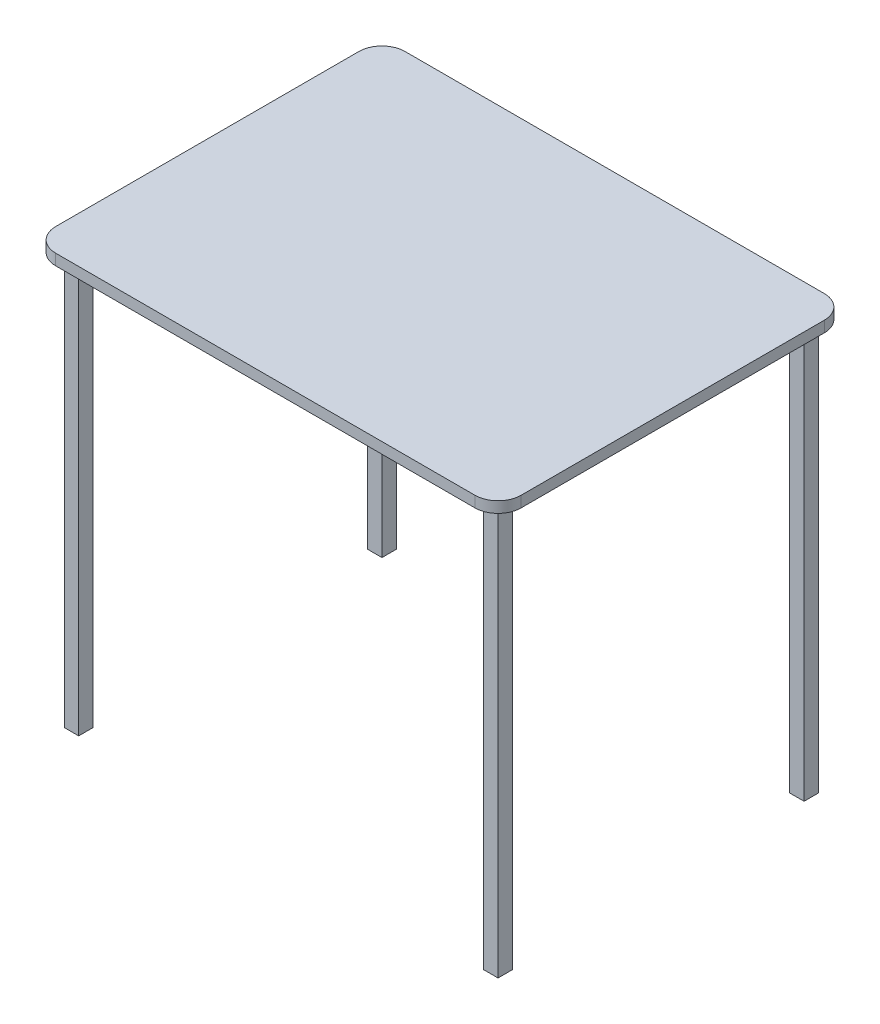
ISO-10303-21;
HEADER;
FILE_DESCRIPTION(('STEP AP214'),'2;1');
FILE_NAME('part.step','',(''),(''),'','','');
FILE_SCHEMA(('AUTOMOTIVE_DESIGN { 1 0 10303 214 1 1 1 1 }'));
ENDSEC;
DATA;
#1=APPLICATION_CONTEXT('core data for automotive mechanical design processes');
#2=APPLICATION_PROTOCOL_DEFINITION('international standard','automotive_design',2000,#1);
#3=PRODUCT_CONTEXT('',#1,'mechanical');
#4=PRODUCT('Part','Part','',(#3));
#5=PRODUCT_RELATED_PRODUCT_CATEGORY('part','',(#4));
#6=PRODUCT_DEFINITION_FORMATION('','',#4);
#7=PRODUCT_DEFINITION_CONTEXT('part definition',#1,'design');
#8=PRODUCT_DEFINITION('design','',#6,#7);
#9=PRODUCT_DEFINITION_SHAPE('','',#8);
#10=(LENGTH_UNIT() NAMED_UNIT(*) SI_UNIT(.MILLI.,.METRE.));
#11=(NAMED_UNIT(*) PLANE_ANGLE_UNIT() SI_UNIT($,.RADIAN.));
#12=(NAMED_UNIT(*) SI_UNIT($,.STERADIAN.) SOLID_ANGLE_UNIT());
#13=UNCERTAINTY_MEASURE_WITH_UNIT(LENGTH_MEASURE(1.E-05),#10,'distance_accuracy_value','');
#14=(GEOMETRIC_REPRESENTATION_CONTEXT(3) GLOBAL_UNCERTAINTY_ASSIGNED_CONTEXT((#13)) GLOBAL_UNIT_ASSIGNED_CONTEXT((#10,
#11,#12)) REPRESENTATION_CONTEXT('',''));
#15=CARTESIAN_POINT('',(0.,0.,0.));
#16=DIRECTION('',(0.,0.,1.));
#17=DIRECTION('',(1.,0.,0.));
#18=AXIS2_PLACEMENT_3D('',#15,#16,#17);
#19=CARTESIAN_POINT('',(0.,0.,0.));
#20=DIRECTION('',(0.,1.,0.));
#21=DIRECTION('',(0.,0.,1.));
#22=AXIS2_PLACEMENT_3D('',#19,#20,#21);
#23=PLANE('',#22);
#24=DIRECTION('',(1.,0.,0.));
#25=VECTOR('',#24,1.);
#26=CARTESIAN_POINT('',(-378.,0.,-277.5));
#27=LINE('',#26,#25);
#28=CARTESIAN_POINT('',(-378.,0.,-277.5));
#29=VERTEX_POINT('',#28);
#30=CARTESIAN_POINT('',(-353.,0.,-277.5));
#31=VERTEX_POINT('',#30);
#32=EDGE_CURVE('E203',#29,#31,#27,.T.);
#33=ORIENTED_EDGE('',*,*,#32,.F.);
#34=DIRECTION('',(0.,0.,1.));
#35=VECTOR('',#34,1.);
#36=CARTESIAN_POINT('',(-378.,0.,-277.5));
#37=LINE('',#36,#35);
#38=CARTESIAN_POINT('',(-378.,0.,-252.5));
#39=VERTEX_POINT('',#38);
#40=EDGE_CURVE('E212',#29,#39,#37,.T.);
#41=ORIENTED_EDGE('',*,*,#40,.T.);
#42=DIRECTION('',(1.,0.,0.));
#43=VECTOR('',#42,1.);
#44=CARTESIAN_POINT('',(-378.,0.,-252.5));
#45=LINE('',#44,#43);
#46=CARTESIAN_POINT('',(-353.,0.,-252.5));
#47=VERTEX_POINT('',#46);
#48=EDGE_CURVE('E219',#39,#47,#45,.T.);
#49=ORIENTED_EDGE('',*,*,#48,.T.);
#50=DIRECTION('',(0.,0.,1.));
#51=VECTOR('',#50,1.);
#52=CARTESIAN_POINT('',(-353.,0.,-277.5));
#53=LINE('',#52,#51);
#54=EDGE_CURVE('E223',#31,#47,#53,.T.);
#55=ORIENTED_EDGE('',*,*,#54,.F.);
#56=EDGE_LOOP('',(#33,#41,#49,#55));
#57=FACE_BOUND('',#56,.T.);
#58=DIRECTION('',(-1.,0.,0.));
#59=VECTOR('',#58,1.);
#60=CARTESIAN_POINT('',(378.,0.,277.5));
#61=LINE('',#60,#59);
#62=CARTESIAN_POINT('',(378.,0.,277.5));
#63=VERTEX_POINT('',#62);
#64=CARTESIAN_POINT('',(353.,0.,277.5));
#65=VERTEX_POINT('',#64);
#66=EDGE_CURVE('E290',#63,#65,#61,.T.);
#67=ORIENTED_EDGE('',*,*,#66,.F.);
#68=DIRECTION('',(0.,0.,-1.));
#69=VECTOR('',#68,1.);
#70=CARTESIAN_POINT('',(378.,0.,277.5));
#71=LINE('',#70,#69);
#72=CARTESIAN_POINT('',(378.,0.,252.5));
#73=VERTEX_POINT('',#72);
#74=EDGE_CURVE('E303',#63,#73,#71,.T.);
#75=ORIENTED_EDGE('',*,*,#74,.T.);
#76=DIRECTION('',(-1.,0.,0.));
#77=VECTOR('',#76,1.);
#78=CARTESIAN_POINT('',(378.,0.,252.5));
#79=LINE('',#78,#77);
#80=CARTESIAN_POINT('',(353.,0.,252.5));
#81=VERTEX_POINT('',#80);
#82=EDGE_CURVE('E317',#73,#81,#79,.T.);
#83=ORIENTED_EDGE('',*,*,#82,.T.);
#84=DIRECTION('',(0.,0.,-1.));
#85=VECTOR('',#84,1.);
#86=CARTESIAN_POINT('',(353.,0.,277.5));
#87=LINE('',#86,#85);
#88=EDGE_CURVE('E314',#65,#81,#87,.T.);
#89=ORIENTED_EDGE('',*,*,#88,.F.);
#90=EDGE_LOOP('',(#67,#75,#83,#89));
#91=FACE_BOUND('',#90,.T.);
#92=DIRECTION('',(0.,0.,-1.));
#93=VECTOR('',#92,1.);
#94=CARTESIAN_POINT('',(-403.,0.,302.5));
#95=LINE('',#94,#93);
#96=CARTESIAN_POINT('',(-403.,0.,262.5));
#97=VERTEX_POINT('',#96);
#98=CARTESIAN_POINT('',(-403.,0.,-262.5));
#99=VERTEX_POINT('',#98);
#100=EDGE_CURVE('E334',#97,#99,#95,.T.);
#101=ORIENTED_EDGE('',*,*,#100,.T.);
#102=CARTESIAN_POINT('',(-363.,0.,-262.5));
#103=DIRECTION('',(0.,1.,0.));
#104=DIRECTION('',(0.,0.,1.));
#105=AXIS2_PLACEMENT_3D('',#102,#103,#104);
#106=CIRCLE('',#105,40.);
#107=CARTESIAN_POINT('',(-363.,0.,-302.5));
#108=VERTEX_POINT('',#107);
#109=EDGE_CURVE('E374',#99,#108,#106,.F.);
#110=ORIENTED_EDGE('',*,*,#109,.T.);
#111=DIRECTION('',(1.,0.,0.));
#112=VECTOR('',#111,1.);
#113=CARTESIAN_POINT('',(-403.,0.,-302.5));
#114=LINE('',#113,#112);
#115=CARTESIAN_POINT('',(363.,0.,-302.5));
#116=VERTEX_POINT('',#115);
#117=EDGE_CURVE('E330',#108,#116,#114,.T.);
#118=ORIENTED_EDGE('',*,*,#117,.T.);
#119=CARTESIAN_POINT('',(363.,0.,-262.5));
#120=DIRECTION('',(0.,1.,0.));
#121=DIRECTION('',(0.,0.,1.));
#122=AXIS2_PLACEMENT_3D('',#119,#120,#121);
#123=CIRCLE('',#122,40.);
#124=CARTESIAN_POINT('',(403.,0.,-262.5));
#125=VERTEX_POINT('',#124);
#126=EDGE_CURVE('E372',#116,#125,#123,.F.);
#127=ORIENTED_EDGE('',*,*,#126,.T.);
#128=DIRECTION('',(0.,0.,-1.));
#129=VECTOR('',#128,1.);
#130=CARTESIAN_POINT('',(403.,0.,302.5));
#131=LINE('',#130,#129);
#132=CARTESIAN_POINT('',(403.,0.,262.5));
#133=VERTEX_POINT('',#132);
#134=EDGE_CURVE('E344',#133,#125,#131,.T.);
#135=ORIENTED_EDGE('',*,*,#134,.F.);
#136=CARTESIAN_POINT('',(363.,0.,262.5));
#137=DIRECTION('',(0.,1.,0.));
#138=DIRECTION('',(0.,0.,1.));
#139=AXIS2_PLACEMENT_3D('',#136,#137,#138);
#140=CIRCLE('',#139,40.);
#141=CARTESIAN_POINT('',(363.,0.,302.5));
#142=VERTEX_POINT('',#141);
#143=EDGE_CURVE('E352',#133,#142,#140,.F.);
#144=ORIENTED_EDGE('',*,*,#143,.T.);
#145=DIRECTION('',(1.,0.,0.));
#146=VECTOR('',#145,1.);
#147=CARTESIAN_POINT('',(-403.,0.,302.5));
#148=LINE('',#147,#146);
#149=CARTESIAN_POINT('',(-363.,0.,302.5));
#150=VERTEX_POINT('',#149);
#151=EDGE_CURVE('E346',#150,#142,#148,.T.);
#152=ORIENTED_EDGE('',*,*,#151,.F.);
#153=CARTESIAN_POINT('',(-363.,0.,262.5));
#154=DIRECTION('',(0.,1.,0.));
#155=DIRECTION('',(0.,0.,1.));
#156=AXIS2_PLACEMENT_3D('',#153,#154,#155);
#157=CIRCLE('',#156,40.);
#158=EDGE_CURVE('E363',#150,#97,#157,.F.);
#159=ORIENTED_EDGE('',*,*,#158,.T.);
#160=EDGE_LOOP('',(#101,#110,#118,#127,#135,#144,#152,#159));
#161=FACE_BOUND('',#160,.T.);
#162=DIRECTION('',(0.,0.,-1.));
#163=VECTOR('',#162,1.);
#164=CARTESIAN_POINT('',(-373.178585117825,0.,277.5));
#165=LINE('',#164,#163);
#166=CARTESIAN_POINT('',(-373.178585117825,0.,277.5));
#167=VERTEX_POINT('',#166);
#168=CARTESIAN_POINT('',(-373.178585117825,0.,252.5));
#169=VERTEX_POINT('',#168);
#170=EDGE_CURVE('E279',#167,#169,#165,.T.);
#171=ORIENTED_EDGE('',*,*,#170,.F.);
#172=DIRECTION('',(1.,0.,0.));
#173=VECTOR('',#172,1.);
#174=CARTESIAN_POINT('',(-373.178585117825,0.,277.5));
#175=LINE('',#174,#173);
#176=CARTESIAN_POINT('',(-348.178585117825,0.,277.5));
#177=VERTEX_POINT('',#176);
#178=EDGE_CURVE('E287',#167,#177,#175,.T.);
#179=ORIENTED_EDGE('',*,*,#178,.T.);
#180=DIRECTION('',(0.,0.,-1.));
#181=VECTOR('',#180,1.);
#182=CARTESIAN_POINT('',(-348.178585117825,0.,277.5));
#183=LINE('',#182,#181);
#184=CARTESIAN_POINT('',(-348.178585117825,0.,252.5));
#185=VERTEX_POINT('',#184);
#186=EDGE_CURVE('E284',#177,#185,#183,.T.);
#187=ORIENTED_EDGE('',*,*,#186,.T.);
#188=DIRECTION('',(1.,0.,0.));
#189=VECTOR('',#188,1.);
#190=CARTESIAN_POINT('',(-373.178585117825,0.,252.5));
#191=LINE('',#190,#189);
#192=EDGE_CURVE('E281',#169,#185,#191,.T.);
#193=ORIENTED_EDGE('',*,*,#192,.F.);
#194=EDGE_LOOP('',(#171,#179,#187,#193));
#195=FACE_BOUND('',#194,.T.);
#196=DIRECTION('',(0.,0.,1.));
#197=VECTOR('',#196,1.);
#198=CARTESIAN_POINT('',(378.,0.,-277.5));
#199=LINE('',#198,#197);
#200=CARTESIAN_POINT('',(378.,0.,-277.5));
#201=VERTEX_POINT('',#200);
#202=CARTESIAN_POINT('',(378.,0.,-252.5));
#203=VERTEX_POINT('',#202);
#204=EDGE_CURVE('E256',#201,#203,#199,.T.);
#205=ORIENTED_EDGE('',*,*,#204,.F.);
#206=DIRECTION('',(-1.,0.,0.));
#207=VECTOR('',#206,1.);
#208=CARTESIAN_POINT('',(378.,0.,-277.5));
#209=LINE('',#208,#207);
#210=CARTESIAN_POINT('',(353.,0.,-277.5));
#211=VERTEX_POINT('',#210);
#212=EDGE_CURVE('E246',#201,#211,#209,.T.);
#213=ORIENTED_EDGE('',*,*,#212,.T.);
#214=DIRECTION('',(0.,0.,1.));
#215=VECTOR('',#214,1.);
#216=CARTESIAN_POINT('',(353.,0.,-277.5));
#217=LINE('',#216,#215);
#218=CARTESIAN_POINT('',(353.,0.,-252.5));
#219=VERTEX_POINT('',#218);
#220=EDGE_CURVE('E249',#211,#219,#217,.T.);
#221=ORIENTED_EDGE('',*,*,#220,.T.);
#222=DIRECTION('',(-1.,0.,0.));
#223=VECTOR('',#222,1.);
#224=CARTESIAN_POINT('',(378.,0.,-252.5));
#225=LINE('',#224,#223);
#226=EDGE_CURVE('E253',#203,#219,#225,.T.);
#227=ORIENTED_EDGE('',*,*,#226,.F.);
#228=EDGE_LOOP('',(#205,#213,#221,#227));
#229=FACE_BOUND('',#228,.T.);
#230=ADVANCED_FACE('F37',(#57,#91,#161,#195,#229),#23,.F.);
#231=CARTESIAN_POINT('',(-403.,19.,-302.5));
#232=DIRECTION('',(0.,0.,-1.));
#233=DIRECTION('',(-1.,0.,0.));
#234=AXIS2_PLACEMENT_3D('',#231,#232,#233);
#235=PLANE('',#234);
#236=ORIENTED_EDGE('',*,*,#117,.F.);
#237=DIRECTION('',(0.,-1.,0.));
#238=VECTOR('',#237,1.);
#239=CARTESIAN_POINT('',(-363.,19.,-302.5));
#240=LINE('',#239,#238);
#241=CARTESIAN_POINT('',(-363.,19.,-302.5));
#242=VERTEX_POINT('',#241);
#243=EDGE_CURVE('E379',#108,#242,#240,.F.);
#244=ORIENTED_EDGE('',*,*,#243,.T.);
#245=DIRECTION('',(1.,0.,0.));
#246=VECTOR('',#245,1.);
#247=CARTESIAN_POINT('',(-403.,19.,-302.5));
#248=LINE('',#247,#246);
#249=CARTESIAN_POINT('',(363.,19.,-302.5));
#250=VERTEX_POINT('',#249);
#251=EDGE_CURVE('E331',#242,#250,#248,.T.);
#252=ORIENTED_EDGE('',*,*,#251,.T.);
#253=DIRECTION('',(0.,-1.,0.));
#254=VECTOR('',#253,1.);
#255=CARTESIAN_POINT('',(363.,0.,-302.5));
#256=LINE('',#255,#254);
#257=EDGE_CURVE('E376',#250,#116,#256,.T.);
#258=ORIENTED_EDGE('',*,*,#257,.T.);
#259=EDGE_LOOP('',(#236,#244,#252,#258));
#260=FACE_BOUND('',#259,.T.);
#261=ADVANCED_FACE('F397',(#260),#235,.T.);
#262=CARTESIAN_POINT('',(-403.,19.,302.5));
#263=DIRECTION('',(-1.,0.,0.));
#264=DIRECTION('',(0.,0.,1.));
#265=AXIS2_PLACEMENT_3D('',#262,#263,#264);
#266=PLANE('',#265);
#267=DIRECTION('',(0.,0.,-1.));
#268=VECTOR('',#267,1.);
#269=CARTESIAN_POINT('',(-403.,19.,302.5));
#270=LINE('',#269,#268);
#271=CARTESIAN_POINT('',(-403.,19.,262.5));
#272=VERTEX_POINT('',#271);
#273=CARTESIAN_POINT('',(-403.,19.,-262.5));
#274=VERTEX_POINT('',#273);
#275=EDGE_CURVE('E338',#272,#274,#270,.T.);
#276=ORIENTED_EDGE('',*,*,#275,.T.);
#277=DIRECTION('',(0.,-1.,0.));
#278=VECTOR('',#277,1.);
#279=CARTESIAN_POINT('',(-403.,19.,-262.5));
#280=LINE('',#279,#278);
#281=EDGE_CURVE('E369',#274,#99,#280,.T.);
#282=ORIENTED_EDGE('',*,*,#281,.T.);
#283=ORIENTED_EDGE('',*,*,#100,.F.);
#284=DIRECTION('',(0.,-1.,0.));
#285=VECTOR('',#284,1.);
#286=CARTESIAN_POINT('',(-403.,19.,262.5));
#287=LINE('',#286,#285);
#288=EDGE_CURVE('E365',#97,#272,#287,.F.);
#289=ORIENTED_EDGE('',*,*,#288,.T.);
#290=EDGE_LOOP('',(#276,#282,#283,#289));
#291=FACE_BOUND('',#290,.T.);
#292=ADVANCED_FACE('F389',(#291),#266,.T.);
#293=CARTESIAN_POINT('',(-403.,19.,302.5));
#294=DIRECTION('',(0.,0.,-1.));
#295=DIRECTION('',(-1.,0.,0.));
#296=AXIS2_PLACEMENT_3D('',#293,#294,#295);
#297=PLANE('',#296);
#298=DIRECTION('',(1.,0.,0.));
#299=VECTOR('',#298,1.);
#300=CARTESIAN_POINT('',(-403.,19.,302.5));
#301=LINE('',#300,#299);
#302=CARTESIAN_POINT('',(-363.,19.,302.5));
#303=VERTEX_POINT('',#302);
#304=CARTESIAN_POINT('',(363.,19.,302.5));
#305=VERTEX_POINT('',#304);
#306=EDGE_CURVE('E336',#303,#305,#301,.T.);
#307=ORIENTED_EDGE('',*,*,#306,.F.);
#308=DIRECTION('',(0.,-1.,0.));
#309=VECTOR('',#308,1.);
#310=CARTESIAN_POINT('',(-363.,0.,302.5));
#311=LINE('',#310,#309);
#312=EDGE_CURVE('E360',#303,#150,#311,.T.);
#313=ORIENTED_EDGE('',*,*,#312,.T.);
#314=ORIENTED_EDGE('',*,*,#151,.T.);
#315=DIRECTION('',(0.,-1.,0.));
#316=VECTOR('',#315,1.);
#317=CARTESIAN_POINT('',(363.,19.,302.5));
#318=LINE('',#317,#316);
#319=EDGE_CURVE('E355',#142,#305,#318,.F.);
#320=ORIENTED_EDGE('',*,*,#319,.T.);
#321=EDGE_LOOP('',(#307,#313,#314,#320));
#322=FACE_BOUND('',#321,.T.);
#323=ADVANCED_FACE('F410',(#322),#297,.F.);
#324=CARTESIAN_POINT('',(403.,19.,302.5));
#325=DIRECTION('',(-1.,0.,0.));
#326=DIRECTION('',(0.,0.,1.));
#327=AXIS2_PLACEMENT_3D('',#324,#325,#326);
#328=PLANE('',#327);
#329=ORIENTED_EDGE('',*,*,#134,.T.);
#330=DIRECTION('',(0.,-1.,0.));
#331=VECTOR('',#330,1.);
#332=CARTESIAN_POINT('',(403.,19.,-262.5));
#333=LINE('',#332,#331);
#334=CARTESIAN_POINT('',(403.,19.,-262.5));
#335=VERTEX_POINT('',#334);
#336=EDGE_CURVE('E11',#125,#335,#333,.F.);
#337=ORIENTED_EDGE('',*,*,#336,.T.);
#338=DIRECTION('',(0.,0.,-1.));
#339=VECTOR('',#338,1.);
#340=CARTESIAN_POINT('',(403.,19.,302.5));
#341=LINE('',#340,#339);
#342=CARTESIAN_POINT('',(403.,19.,262.5));
#343=VERTEX_POINT('',#342);
#344=EDGE_CURVE('E333',#343,#335,#341,.T.);
#345=ORIENTED_EDGE('',*,*,#344,.F.);
#346=DIRECTION('',(0.,-1.,0.));
#347=VECTOR('',#346,1.);
#348=CARTESIAN_POINT('',(403.,19.,262.5));
#349=LINE('',#348,#347);
#350=EDGE_CURVE('E341',#343,#133,#349,.T.);
#351=ORIENTED_EDGE('',*,*,#350,.T.);
#352=EDGE_LOOP('',(#329,#337,#345,#351));
#353=FACE_BOUND('',#352,.T.);
#354=ADVANCED_FACE('F401',(#353),#328,.F.);
#355=CARTESIAN_POINT('',(0.,19.,0.));
#356=DIRECTION('',(0.,1.,0.));
#357=DIRECTION('',(0.,0.,1.));
#358=AXIS2_PLACEMENT_3D('',#355,#356,#357);
#359=PLANE('',#358);
#360=ORIENTED_EDGE('',*,*,#251,.F.);
#361=CARTESIAN_POINT('',(-363.,19.,-262.5));
#362=DIRECTION('',(0.,1.,0.));
#363=DIRECTION('',(0.,0.,1.));
#364=AXIS2_PLACEMENT_3D('',#361,#362,#363);
#365=CIRCLE('',#364,40.);
#366=EDGE_CURVE('E45',#242,#274,#365,.T.);
#367=ORIENTED_EDGE('',*,*,#366,.T.);
#368=ORIENTED_EDGE('',*,*,#275,.F.);
#369=CARTESIAN_POINT('',(-363.,19.,262.5));
#370=DIRECTION('',(0.,1.,0.));
#371=DIRECTION('',(0.,0.,1.));
#372=AXIS2_PLACEMENT_3D('',#369,#370,#371);
#373=CIRCLE('',#372,40.);
#374=EDGE_CURVE('E367',#272,#303,#373,.T.);
#375=ORIENTED_EDGE('',*,*,#374,.T.);
#376=ORIENTED_EDGE('',*,*,#306,.T.);
#377=CARTESIAN_POINT('',(363.,19.,262.5));
#378=DIRECTION('',(0.,1.,0.));
#379=DIRECTION('',(0.,0.,1.));
#380=AXIS2_PLACEMENT_3D('',#377,#378,#379);
#381=CIRCLE('',#380,40.);
#382=EDGE_CURVE('E358',#305,#343,#381,.T.);
#383=ORIENTED_EDGE('',*,*,#382,.T.);
#384=ORIENTED_EDGE('',*,*,#344,.T.);
#385=CARTESIAN_POINT('',(363.,19.,-262.5));
#386=DIRECTION('',(0.,1.,0.));
#387=DIRECTION('',(0.,0.,1.));
#388=AXIS2_PLACEMENT_3D('',#385,#386,#387);
#389=CIRCLE('',#388,40.);
#390=EDGE_CURVE('E57',#335,#250,#389,.T.);
#391=ORIENTED_EDGE('',*,*,#390,.T.);
#392=EDGE_LOOP('',(#360,#367,#368,#375,#376,#383,#384,#391));
#393=FACE_BOUND('',#392,.T.);
#394=ADVANCED_FACE('F383',(#393),#359,.T.);
#395=CARTESIAN_POINT('',(378.,-710.,277.5));
#396=DIRECTION('',(0.,0.,-1.));
#397=DIRECTION('',(-1.,0.,0.));
#398=AXIS2_PLACEMENT_3D('',#395,#396,#397);
#399=PLANE('',#398);
#400=ORIENTED_EDGE('',*,*,#66,.T.);
#401=DIRECTION('',(0.,1.,0.));
#402=VECTOR('',#401,1.);
#403=CARTESIAN_POINT('',(353.,-710.,277.5));
#404=LINE('',#403,#402);
#405=CARTESIAN_POINT('',(353.,-710.,277.5));
#406=VERTEX_POINT('',#405);
#407=EDGE_CURVE('E328',#406,#65,#404,.T.);
#408=ORIENTED_EDGE('',*,*,#407,.F.);
#409=DIRECTION('',(-1.,0.,0.));
#410=VECTOR('',#409,1.);
#411=CARTESIAN_POINT('',(378.,-710.,277.5));
#412=LINE('',#411,#410);
#413=CARTESIAN_POINT('',(378.,-710.,277.5));
#414=VERTEX_POINT('',#413);
#415=EDGE_CURVE('E299',#414,#406,#412,.T.);
#416=ORIENTED_EDGE('',*,*,#415,.F.);
#417=DIRECTION('',(0.,1.,0.));
#418=VECTOR('',#417,1.);
#419=CARTESIAN_POINT('',(378.,-710.,277.5));
#420=LINE('',#419,#418);
#421=EDGE_CURVE('E311',#414,#63,#420,.T.);
#422=ORIENTED_EDGE('',*,*,#421,.T.);
#423=EDGE_LOOP('',(#400,#408,#416,#422));
#424=FACE_BOUND('',#423,.T.);
#425=ADVANCED_FACE('F439',(#424),#399,.F.);
#426=CARTESIAN_POINT('',(353.,-710.,277.5));
#427=DIRECTION('',(1.,0.,0.));
#428=DIRECTION('',(0.,0.,-1.));
#429=AXIS2_PLACEMENT_3D('',#426,#427,#428);
#430=PLANE('',#429);
#431=ORIENTED_EDGE('',*,*,#88,.T.);
#432=DIRECTION('',(0.,1.,0.));
#433=VECTOR('',#432,1.);
#434=CARTESIAN_POINT('',(353.,-710.,252.5));
#435=LINE('',#434,#433);
#436=CARTESIAN_POINT('',(353.,-710.,252.5));
#437=VERTEX_POINT('',#436);
#438=EDGE_CURVE('E326',#437,#81,#435,.T.);
#439=ORIENTED_EDGE('',*,*,#438,.F.);
#440=DIRECTION('',(0.,0.,-1.));
#441=VECTOR('',#440,1.);
#442=CARTESIAN_POINT('',(353.,-710.,277.5));
#443=LINE('',#442,#441);
#444=EDGE_CURVE('E302',#406,#437,#443,.T.);
#445=ORIENTED_EDGE('',*,*,#444,.F.);
#446=ORIENTED_EDGE('',*,*,#407,.T.);
#447=EDGE_LOOP('',(#431,#439,#445,#446));
#448=FACE_BOUND('',#447,.T.);
#449=ADVANCED_FACE('F443',(#448),#430,.F.);
#450=CARTESIAN_POINT('',(378.,-710.,252.5));
#451=DIRECTION('',(0.,0.,-1.));
#452=DIRECTION('',(-1.,0.,0.));
#453=AXIS2_PLACEMENT_3D('',#450,#451,#452);
#454=PLANE('',#453);
#455=ORIENTED_EDGE('',*,*,#82,.F.);
#456=DIRECTION('',(0.,1.,0.));
#457=VECTOR('',#456,1.);
#458=CARTESIAN_POINT('',(378.,-710.,252.5));
#459=LINE('',#458,#457);
#460=CARTESIAN_POINT('',(378.,-710.,252.5));
#461=VERTEX_POINT('',#460);
#462=EDGE_CURVE('E323',#461,#73,#459,.T.);
#463=ORIENTED_EDGE('',*,*,#462,.F.);
#464=DIRECTION('',(-1.,0.,0.));
#465=VECTOR('',#464,1.);
#466=CARTESIAN_POINT('',(378.,-710.,252.5));
#467=LINE('',#466,#465);
#468=EDGE_CURVE('E305',#461,#437,#467,.T.);
#469=ORIENTED_EDGE('',*,*,#468,.T.);
#470=ORIENTED_EDGE('',*,*,#438,.T.);
#471=EDGE_LOOP('',(#455,#463,#469,#470));
#472=FACE_BOUND('',#471,.T.);
#473=ADVANCED_FACE('F448',(#472),#454,.T.);
#474=CARTESIAN_POINT('',(378.,-710.,277.5));
#475=DIRECTION('',(1.,0.,0.));
#476=DIRECTION('',(0.,0.,-1.));
#477=AXIS2_PLACEMENT_3D('',#474,#475,#476);
#478=PLANE('',#477);
#479=ORIENTED_EDGE('',*,*,#74,.F.);
#480=ORIENTED_EDGE('',*,*,#421,.F.);
#481=DIRECTION('',(0.,0.,-1.));
#482=VECTOR('',#481,1.);
#483=CARTESIAN_POINT('',(378.,-710.,277.5));
#484=LINE('',#483,#482);
#485=EDGE_CURVE('E308',#414,#461,#484,.T.);
#486=ORIENTED_EDGE('',*,*,#485,.T.);
#487=ORIENTED_EDGE('',*,*,#462,.T.);
#488=EDGE_LOOP('',(#479,#480,#486,#487));
#489=FACE_BOUND('',#488,.T.);
#490=ADVANCED_FACE('F454',(#489),#478,.T.);
#491=CARTESIAN_POINT('',(0.,-710.,0.));
#492=DIRECTION('',(0.,-1.,0.));
#493=DIRECTION('',(0.,0.,-1.));
#494=AXIS2_PLACEMENT_3D('',#491,#492,#493);
#495=PLANE('',#494);
#496=ORIENTED_EDGE('',*,*,#415,.T.);
#497=ORIENTED_EDGE('',*,*,#444,.T.);
#498=ORIENTED_EDGE('',*,*,#468,.F.);
#499=ORIENTED_EDGE('',*,*,#485,.F.);
#500=EDGE_LOOP('',(#496,#497,#498,#499));
#501=FACE_BOUND('',#500,.T.);
#502=ADVANCED_FACE('F458',(#501),#495,.T.);
#503=CARTESIAN_POINT('',(-373.178585117825,-710.,277.5));
#504=DIRECTION('',(0.,0.,1.));
#505=DIRECTION('',(1.,0.,0.));
#506=AXIS2_PLACEMENT_3D('',#503,#504,#505);
#507=PLANE('',#506);
#508=ORIENTED_EDGE('',*,*,#178,.F.);
#509=DIRECTION('',(0.,1.,0.));
#510=VECTOR('',#509,1.);
#511=CARTESIAN_POINT('',(-373.178585117825,-710.,277.5));
#512=LINE('',#511,#510);
#513=CARTESIAN_POINT('',(-373.178585117825,-710.,277.5));
#514=VERTEX_POINT('',#513);
#515=EDGE_CURVE('E259',#514,#167,#512,.T.);
#516=ORIENTED_EDGE('',*,*,#515,.F.);
#517=DIRECTION('',(1.,0.,0.));
#518=VECTOR('',#517,1.);
#519=CARTESIAN_POINT('',(-373.178585117825,-710.,277.5));
#520=LINE('',#519,#518);
#521=CARTESIAN_POINT('',(-348.178585117825,-710.,277.5));
#522=VERTEX_POINT('',#521);
#523=EDGE_CURVE('E282',#514,#522,#520,.T.);
#524=ORIENTED_EDGE('',*,*,#523,.T.);
#525=DIRECTION('',(0.,1.,0.));
#526=VECTOR('',#525,1.);
#527=CARTESIAN_POINT('',(-348.178585117825,-710.,277.5));
#528=LINE('',#527,#526);
#529=EDGE_CURVE('E269',#522,#177,#528,.T.);
#530=ORIENTED_EDGE('',*,*,#529,.T.);
#531=EDGE_LOOP('',(#508,#516,#524,#530));
#532=FACE_BOUND('',#531,.T.);
#533=ADVANCED_FACE('F462',(#532),#507,.T.);
#534=CARTESIAN_POINT('',(-373.178585117825,-710.,277.5));
#535=DIRECTION('',(1.,0.,0.));
#536=DIRECTION('',(0.,0.,-1.));
#537=AXIS2_PLACEMENT_3D('',#534,#535,#536);
#538=PLANE('',#537);
#539=ORIENTED_EDGE('',*,*,#170,.T.);
#540=DIRECTION('',(0.,1.,0.));
#541=VECTOR('',#540,1.);
#542=CARTESIAN_POINT('',(-373.178585117825,-710.,252.5));
#543=LINE('',#542,#541);
#544=CARTESIAN_POINT('',(-373.178585117825,-710.,252.5));
#545=VERTEX_POINT('',#544);
#546=EDGE_CURVE('E275',#545,#169,#543,.T.);
#547=ORIENTED_EDGE('',*,*,#546,.F.);
#548=DIRECTION('',(0.,0.,-1.));
#549=VECTOR('',#548,1.);
#550=CARTESIAN_POINT('',(-373.178585117825,-710.,277.5));
#551=LINE('',#550,#549);
#552=EDGE_CURVE('E271',#514,#545,#551,.T.);
#553=ORIENTED_EDGE('',*,*,#552,.F.);
#554=ORIENTED_EDGE('',*,*,#515,.T.);
#555=EDGE_LOOP('',(#539,#547,#553,#554));
#556=FACE_BOUND('',#555,.T.);
#557=ADVANCED_FACE('F470',(#556),#538,.F.);
#558=CARTESIAN_POINT('',(-373.178585117825,-710.,252.5));
#559=DIRECTION('',(0.,0.,1.));
#560=DIRECTION('',(1.,0.,0.));
#561=AXIS2_PLACEMENT_3D('',#558,#559,#560);
#562=PLANE('',#561);
#563=ORIENTED_EDGE('',*,*,#192,.T.);
#564=DIRECTION('',(0.,1.,0.));
#565=VECTOR('',#564,1.);
#566=CARTESIAN_POINT('',(-348.178585117825,-710.,252.5));
#567=LINE('',#566,#565);
#568=CARTESIAN_POINT('',(-348.178585117825,-710.,252.5));
#569=VERTEX_POINT('',#568);
#570=EDGE_CURVE('E272',#569,#185,#567,.T.);
#571=ORIENTED_EDGE('',*,*,#570,.F.);
#572=DIRECTION('',(1.,0.,0.));
#573=VECTOR('',#572,1.);
#574=CARTESIAN_POINT('',(-373.178585117825,-710.,252.5));
#575=LINE('',#574,#573);
#576=EDGE_CURVE('E292',#545,#569,#575,.T.);
#577=ORIENTED_EDGE('',*,*,#576,.F.);
#578=ORIENTED_EDGE('',*,*,#546,.T.);
#579=EDGE_LOOP('',(#563,#571,#577,#578));
#580=FACE_BOUND('',#579,.T.);
#581=ADVANCED_FACE('F473',(#580),#562,.F.);
#582=CARTESIAN_POINT('',(-348.178585117825,-710.,277.5));
#583=DIRECTION('',(1.,0.,0.));
#584=DIRECTION('',(0.,0.,-1.));
#585=AXIS2_PLACEMENT_3D('',#582,#583,#584);
#586=PLANE('',#585);
#587=ORIENTED_EDGE('',*,*,#186,.F.);
#588=ORIENTED_EDGE('',*,*,#529,.F.);
#589=DIRECTION('',(0.,0.,-1.));
#590=VECTOR('',#589,1.);
#591=CARTESIAN_POINT('',(-348.178585117825,-710.,277.5));
#592=LINE('',#591,#590);
#593=EDGE_CURVE('E294',#522,#569,#592,.T.);
#594=ORIENTED_EDGE('',*,*,#593,.T.);
#595=ORIENTED_EDGE('',*,*,#570,.T.);
#596=EDGE_LOOP('',(#587,#588,#594,#595));
#597=FACE_BOUND('',#596,.T.);
#598=ADVANCED_FACE('F468',(#597),#586,.T.);
#599=CARTESIAN_POINT('',(0.,-710.,0.));
#600=DIRECTION('',(0.,1.,0.));
#601=DIRECTION('',(0.,0.,1.));
#602=AXIS2_PLACEMENT_3D('',#599,#600,#601);
#603=PLANE('',#602);
#604=ORIENTED_EDGE('',*,*,#523,.F.);
#605=ORIENTED_EDGE('',*,*,#552,.T.);
#606=ORIENTED_EDGE('',*,*,#576,.T.);
#607=ORIENTED_EDGE('',*,*,#593,.F.);
#608=EDGE_LOOP('',(#604,#605,#606,#607));
#609=FACE_BOUND('',#608,.T.);
#610=ADVANCED_FACE('F464',(#609),#603,.F.);
#611=CARTESIAN_POINT('',(378.,-710.,-277.5));
#612=DIRECTION('',(-1.,0.,0.));
#613=DIRECTION('',(0.,0.,1.));
#614=AXIS2_PLACEMENT_3D('',#611,#612,#613);
#615=PLANE('',#614);
#616=ORIENTED_EDGE('',*,*,#204,.T.);
#617=DIRECTION('',(0.,1.,0.));
#618=VECTOR('',#617,1.);
#619=CARTESIAN_POINT('',(378.,-710.,-252.5));
#620=LINE('',#619,#618);
#621=CARTESIAN_POINT('',(378.,-710.,-252.5));
#622=VERTEX_POINT('',#621);
#623=EDGE_CURVE('E218',#622,#203,#620,.T.);
#624=ORIENTED_EDGE('',*,*,#623,.F.);
#625=DIRECTION('',(0.,0.,1.));
#626=VECTOR('',#625,1.);
#627=CARTESIAN_POINT('',(378.,-710.,-277.5));
#628=LINE('',#627,#626);
#629=CARTESIAN_POINT('',(378.,-710.,-277.5));
#630=VERTEX_POINT('',#629);
#631=EDGE_CURVE('E250',#630,#622,#628,.T.);
#632=ORIENTED_EDGE('',*,*,#631,.F.);
#633=DIRECTION('',(0.,1.,0.));
#634=VECTOR('',#633,1.);
#635=CARTESIAN_POINT('',(378.,-710.,-277.5));
#636=LINE('',#635,#634);
#637=EDGE_CURVE('E243',#630,#201,#636,.T.);
#638=ORIENTED_EDGE('',*,*,#637,.T.);
#639=EDGE_LOOP('',(#616,#624,#632,#638));
#640=FACE_BOUND('',#639,.T.);
#641=ADVANCED_FACE('F467',(#640),#615,.F.);
#642=CARTESIAN_POINT('',(378.,-710.,-252.5));
#643=DIRECTION('',(0.,0.,-1.));
#644=DIRECTION('',(-1.,0.,0.));
#645=AXIS2_PLACEMENT_3D('',#642,#643,#644);
#646=PLANE('',#645);
#647=ORIENTED_EDGE('',*,*,#226,.T.);
#648=DIRECTION('',(0.,1.,0.));
#649=VECTOR('',#648,1.);
#650=CARTESIAN_POINT('',(353.,-710.,-252.5));
#651=LINE('',#650,#649);
#652=CARTESIAN_POINT('',(353.,-710.,-252.5));
#653=VERTEX_POINT('',#652);
#654=EDGE_CURVE('E238',#653,#219,#651,.T.);
#655=ORIENTED_EDGE('',*,*,#654,.F.);
#656=DIRECTION('',(-1.,0.,0.));
#657=VECTOR('',#656,1.);
#658=CARTESIAN_POINT('',(378.,-710.,-252.5));
#659=LINE('',#658,#657);
#660=EDGE_CURVE('E265',#622,#653,#659,.T.);
#661=ORIENTED_EDGE('',*,*,#660,.F.);
#662=ORIENTED_EDGE('',*,*,#623,.T.);
#663=EDGE_LOOP('',(#647,#655,#661,#662));
#664=FACE_BOUND('',#663,.T.);
#665=ADVANCED_FACE('F495',(#664),#646,.F.);
#666=CARTESIAN_POINT('',(353.,-710.,-277.5));
#667=DIRECTION('',(-1.,0.,0.));
#668=DIRECTION('',(0.,0.,1.));
#669=AXIS2_PLACEMENT_3D('',#666,#667,#668);
#670=PLANE('',#669);
#671=ORIENTED_EDGE('',*,*,#220,.F.);
#672=DIRECTION('',(0.,1.,0.));
#673=VECTOR('',#672,1.);
#674=CARTESIAN_POINT('',(353.,-710.,-277.5));
#675=LINE('',#674,#673);
#676=CARTESIAN_POINT('',(353.,-710.,-277.5));
#677=VERTEX_POINT('',#676);
#678=EDGE_CURVE('E240',#677,#211,#675,.T.);
#679=ORIENTED_EDGE('',*,*,#678,.F.);
#680=DIRECTION('',(0.,0.,1.));
#681=VECTOR('',#680,1.);
#682=CARTESIAN_POINT('',(353.,-710.,-277.5));
#683=LINE('',#682,#681);
#684=EDGE_CURVE('E262',#677,#653,#683,.T.);
#685=ORIENTED_EDGE('',*,*,#684,.T.);
#686=ORIENTED_EDGE('',*,*,#654,.T.);
#687=EDGE_LOOP('',(#671,#679,#685,#686));
#688=FACE_BOUND('',#687,.T.);
#689=ADVANCED_FACE('F491',(#688),#670,.T.);
#690=CARTESIAN_POINT('',(378.,-710.,-277.5));
#691=DIRECTION('',(0.,0.,-1.));
#692=DIRECTION('',(-1.,0.,0.));
#693=AXIS2_PLACEMENT_3D('',#690,#691,#692);
#694=PLANE('',#693);
#695=ORIENTED_EDGE('',*,*,#212,.F.);
#696=ORIENTED_EDGE('',*,*,#637,.F.);
#697=DIRECTION('',(-1.,0.,0.));
#698=VECTOR('',#697,1.);
#699=CARTESIAN_POINT('',(378.,-710.,-277.5));
#700=LINE('',#699,#698);
#701=EDGE_CURVE('E245',#630,#677,#700,.T.);
#702=ORIENTED_EDGE('',*,*,#701,.T.);
#703=ORIENTED_EDGE('',*,*,#678,.T.);
#704=EDGE_LOOP('',(#695,#696,#702,#703));
#705=FACE_BOUND('',#704,.T.);
#706=ADVANCED_FACE('F487',(#705),#694,.T.);
#707=CARTESIAN_POINT('',(0.,-710.,0.));
#708=DIRECTION('',(0.,-1.,0.));
#709=DIRECTION('',(0.,0.,-1.));
#710=AXIS2_PLACEMENT_3D('',#707,#708,#709);
#711=PLANE('',#710);
#712=ORIENTED_EDGE('',*,*,#631,.T.);
#713=ORIENTED_EDGE('',*,*,#660,.T.);
#714=ORIENTED_EDGE('',*,*,#684,.F.);
#715=ORIENTED_EDGE('',*,*,#701,.F.);
#716=EDGE_LOOP('',(#712,#713,#714,#715));
#717=FACE_BOUND('',#716,.T.);
#718=ADVANCED_FACE('F484',(#717),#711,.T.);
#719=CARTESIAN_POINT('',(-378.,-710.,-277.5));
#720=DIRECTION('',(-1.,0.,0.));
#721=DIRECTION('',(0.,0.,1.));
#722=AXIS2_PLACEMENT_3D('',#719,#720,#721);
#723=PLANE('',#722);
#724=ORIENTED_EDGE('',*,*,#40,.F.);
#725=DIRECTION('',(0.,1.,0.));
#726=VECTOR('',#725,1.);
#727=CARTESIAN_POINT('',(-378.,-710.,-277.5));
#728=LINE('',#727,#726);
#729=CARTESIAN_POINT('',(-378.,-710.,-277.5));
#730=VERTEX_POINT('',#729);
#731=EDGE_CURVE('E198',#730,#29,#728,.T.);
#732=ORIENTED_EDGE('',*,*,#731,.F.);
#733=DIRECTION('',(0.,0.,1.));
#734=VECTOR('',#733,1.);
#735=CARTESIAN_POINT('',(-378.,-710.,-277.5));
#736=LINE('',#735,#734);
#737=CARTESIAN_POINT('',(-378.,-710.,-252.5));
#738=VERTEX_POINT('',#737);
#739=EDGE_CURVE('E224',#730,#738,#736,.T.);
#740=ORIENTED_EDGE('',*,*,#739,.T.);
#741=DIRECTION('',(0.,1.,0.));
#742=VECTOR('',#741,1.);
#743=CARTESIAN_POINT('',(-378.,-710.,-252.5));
#744=LINE('',#743,#742);
#745=EDGE_CURVE('E214',#738,#39,#744,.T.);
#746=ORIENTED_EDGE('',*,*,#745,.T.);
#747=EDGE_LOOP('',(#724,#732,#740,#746));
#748=FACE_BOUND('',#747,.T.);
#749=ADVANCED_FACE('F213',(#748),#723,.T.);
#750=CARTESIAN_POINT('',(-378.,-710.,-277.5));
#751=DIRECTION('',(0.,0.,1.));
#752=DIRECTION('',(1.,0.,0.));
#753=AXIS2_PLACEMENT_3D('',#750,#751,#752);
#754=PLANE('',#753);
#755=ORIENTED_EDGE('',*,*,#32,.T.);
#756=DIRECTION('',(0.,1.,0.));
#757=VECTOR('',#756,1.);
#758=CARTESIAN_POINT('',(-353.,-710.,-277.5));
#759=LINE('',#758,#757);
#760=CARTESIAN_POINT('',(-353.,-710.,-277.5));
#761=VERTEX_POINT('',#760);
#762=EDGE_CURVE('E209',#761,#31,#759,.T.);
#763=ORIENTED_EDGE('',*,*,#762,.F.);
#764=DIRECTION('',(1.,0.,0.));
#765=VECTOR('',#764,1.);
#766=CARTESIAN_POINT('',(-378.,-710.,-277.5));
#767=LINE('',#766,#765);
#768=EDGE_CURVE('E205',#730,#761,#767,.T.);
#769=ORIENTED_EDGE('',*,*,#768,.F.);
#770=ORIENTED_EDGE('',*,*,#731,.T.);
#771=EDGE_LOOP('',(#755,#763,#769,#770));
#772=FACE_BOUND('',#771,.T.);
#773=ADVANCED_FACE('F200',(#772),#754,.F.);
#774=CARTESIAN_POINT('',(-353.,-710.,-277.5));
#775=DIRECTION('',(-1.,0.,0.));
#776=DIRECTION('',(0.,0.,1.));
#777=AXIS2_PLACEMENT_3D('',#774,#775,#776);
#778=PLANE('',#777);
#779=ORIENTED_EDGE('',*,*,#54,.T.);
#780=DIRECTION('',(0.,1.,0.));
#781=VECTOR('',#780,1.);
#782=CARTESIAN_POINT('',(-353.,-710.,-252.5));
#783=LINE('',#782,#781);
#784=CARTESIAN_POINT('',(-353.,-710.,-252.5));
#785=VERTEX_POINT('',#784);
#786=EDGE_CURVE('E691',#785,#47,#783,.T.);
#787=ORIENTED_EDGE('',*,*,#786,.F.);
#788=DIRECTION('',(0.,0.,1.));
#789=VECTOR('',#788,1.);
#790=CARTESIAN_POINT('',(-353.,-710.,-277.5));
#791=LINE('',#790,#789);
#792=EDGE_CURVE('E233',#761,#785,#791,.T.);
#793=ORIENTED_EDGE('',*,*,#792,.F.);
#794=ORIENTED_EDGE('',*,*,#762,.T.);
#795=EDGE_LOOP('',(#779,#787,#793,#794));
#796=FACE_BOUND('',#795,.T.);
#797=ADVANCED_FACE('F509',(#796),#778,.F.);
#798=CARTESIAN_POINT('',(-378.,-710.,-252.5));
#799=DIRECTION('',(0.,0.,1.));
#800=DIRECTION('',(1.,0.,0.));
#801=AXIS2_PLACEMENT_3D('',#798,#799,#800);
#802=PLANE('',#801);
#803=ORIENTED_EDGE('',*,*,#48,.F.);
#804=ORIENTED_EDGE('',*,*,#745,.F.);
#805=DIRECTION('',(1.,0.,0.));
#806=VECTOR('',#805,1.);
#807=CARTESIAN_POINT('',(-378.,-710.,-252.5));
#808=LINE('',#807,#806);
#809=EDGE_CURVE('E227',#738,#785,#808,.T.);
#810=ORIENTED_EDGE('',*,*,#809,.T.);
#811=ORIENTED_EDGE('',*,*,#786,.T.);
#812=EDGE_LOOP('',(#803,#804,#810,#811));
#813=FACE_BOUND('',#812,.T.);
#814=ADVANCED_FACE('F505',(#813),#802,.T.);
#815=CARTESIAN_POINT('',(0.,-710.,0.));
#816=DIRECTION('',(0.,1.,0.));
#817=DIRECTION('',(0.,0.,1.));
#818=AXIS2_PLACEMENT_3D('',#815,#816,#817);
#819=PLANE('',#818);
#820=ORIENTED_EDGE('',*,*,#739,.F.);
#821=ORIENTED_EDGE('',*,*,#768,.T.);
#822=ORIENTED_EDGE('',*,*,#792,.T.);
#823=ORIENTED_EDGE('',*,*,#809,.F.);
#824=EDGE_LOOP('',(#820,#821,#822,#823));
#825=FACE_BOUND('',#824,.T.);
#826=ADVANCED_FACE('F420',(#825),#819,.F.);
#827=CARTESIAN_POINT('',(363.,19.,262.5));
#828=DIRECTION('',(0.,-1.,0.));
#829=DIRECTION('',(0.,0.,-1.));
#830=AXIS2_PLACEMENT_3D('',#827,#828,#829);
#831=CYLINDRICAL_SURFACE('',#830,40.);
#832=ORIENTED_EDGE('',*,*,#382,.F.);
#833=ORIENTED_EDGE('',*,*,#319,.F.);
#834=ORIENTED_EDGE('',*,*,#143,.F.);
#835=ORIENTED_EDGE('',*,*,#350,.F.);
#836=EDGE_LOOP('',(#832,#833,#834,#835));
#837=FACE_BOUND('',#836,.T.);
#838=ADVANCED_FACE('F405',(#837),#831,.T.);
#839=CARTESIAN_POINT('',(-363.,19.,262.5));
#840=DIRECTION('',(0.,1.,0.));
#841=DIRECTION('',(0.,0.,1.));
#842=AXIS2_PLACEMENT_3D('',#839,#840,#841);
#843=CYLINDRICAL_SURFACE('',#842,40.);
#844=ORIENTED_EDGE('',*,*,#374,.F.);
#845=ORIENTED_EDGE('',*,*,#288,.F.);
#846=ORIENTED_EDGE('',*,*,#158,.F.);
#847=ORIENTED_EDGE('',*,*,#312,.F.);
#848=EDGE_LOOP('',(#844,#845,#846,#847));
#849=FACE_BOUND('',#848,.T.);
#850=ADVANCED_FACE('F413',(#849),#843,.T.);
#851=CARTESIAN_POINT('',(-363.,19.,-262.5));
#852=DIRECTION('',(0.,-1.,0.));
#853=DIRECTION('',(0.,0.,-1.));
#854=AXIS2_PLACEMENT_3D('',#851,#852,#853);
#855=CYLINDRICAL_SURFACE('',#854,40.);
#856=ORIENTED_EDGE('',*,*,#366,.F.);
#857=ORIENTED_EDGE('',*,*,#243,.F.);
#858=ORIENTED_EDGE('',*,*,#109,.F.);
#859=ORIENTED_EDGE('',*,*,#281,.F.);
#860=EDGE_LOOP('',(#856,#857,#858,#859));
#861=FACE_BOUND('',#860,.T.);
#862=ADVANCED_FACE('F392',(#861),#855,.T.);
#863=CARTESIAN_POINT('',(363.,19.,-262.5));
#864=DIRECTION('',(0.,1.,0.));
#865=DIRECTION('',(0.,0.,1.));
#866=AXIS2_PLACEMENT_3D('',#863,#864,#865);
#867=CYLINDRICAL_SURFACE('',#866,40.);
#868=ORIENTED_EDGE('',*,*,#390,.F.);
#869=ORIENTED_EDGE('',*,*,#336,.F.);
#870=ORIENTED_EDGE('',*,*,#126,.F.);
#871=ORIENTED_EDGE('',*,*,#257,.F.);
#872=EDGE_LOOP('',(#868,#869,#870,#871));
#873=FACE_BOUND('',#872,.T.);
#874=ADVANCED_FACE('F39',(#873),#867,.T.);
#875=CLOSED_SHELL('',(#230,#261,#292,#323,#354,#394,#425,#449,#473,#490,#502,#533,#557,#581,
#598,#610,#641,#665,#689,#706,#718,#749,#773,#797,#814,#826,#838,#850,#862,#874));
#876=MANIFOLD_SOLID_BREP('B2',#875);
#877=ADVANCED_BREP_SHAPE_REPRESENTATION('',(#18,#876),#14);
#878=SHAPE_DEFINITION_REPRESENTATION(#9,#877);
ENDSEC;
END-ISO-10303-21;
